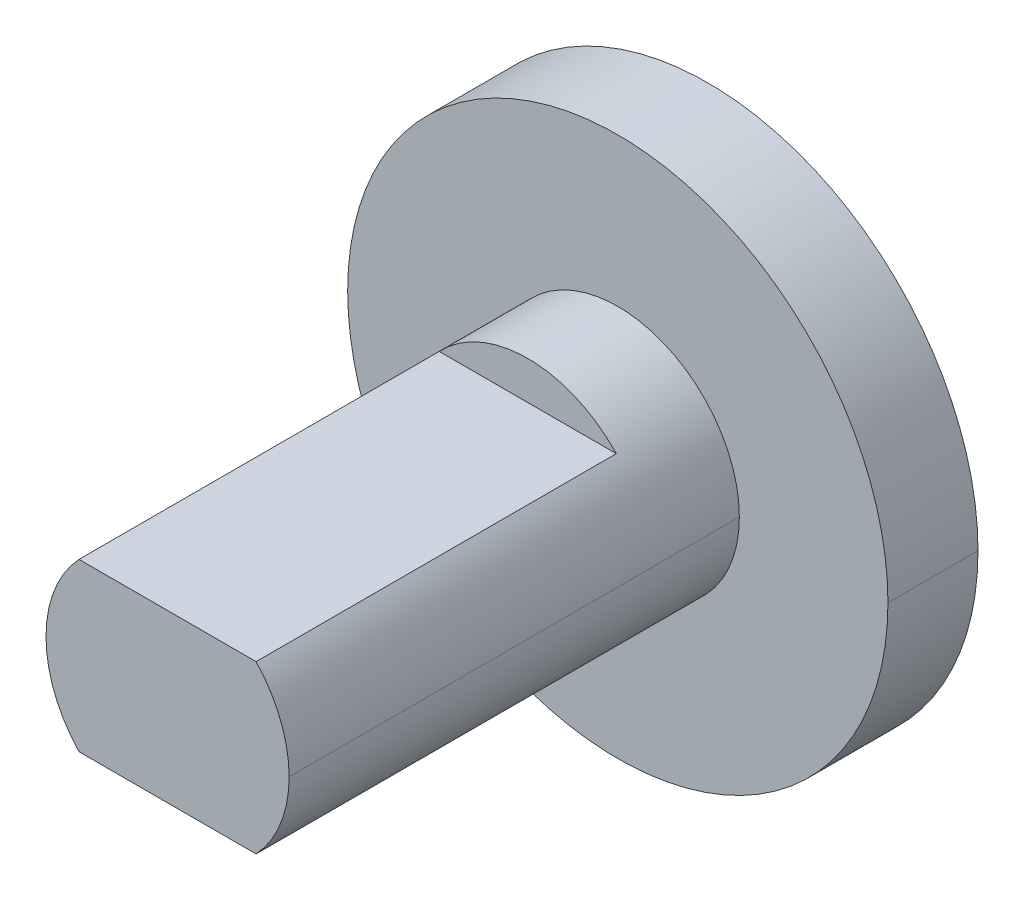
ISO-10303-21;
HEADER;
FILE_DESCRIPTION(('STEP AP214'),'2;1');
FILE_NAME('part.step','',(''),(''),'','','');
FILE_SCHEMA(('AUTOMOTIVE_DESIGN { 1 0 10303 214 1 1 1 1 }'));
ENDSEC;
DATA;
#1=APPLICATION_CONTEXT('core data for automotive mechanical design processes');
#2=APPLICATION_PROTOCOL_DEFINITION('international standard','automotive_design',2000,#1);
#3=PRODUCT_CONTEXT('',#1,'mechanical');
#4=PRODUCT('Part','Part','',(#3));
#5=PRODUCT_RELATED_PRODUCT_CATEGORY('part','',(#4));
#6=PRODUCT_DEFINITION_FORMATION('','',#4);
#7=PRODUCT_DEFINITION_CONTEXT('part definition',#1,'design');
#8=PRODUCT_DEFINITION('design','',#6,#7);
#9=PRODUCT_DEFINITION_SHAPE('','',#8);
#10=(LENGTH_UNIT() NAMED_UNIT(*) SI_UNIT(.MILLI.,.METRE.));
#11=(NAMED_UNIT(*) PLANE_ANGLE_UNIT() SI_UNIT($,.RADIAN.));
#12=(NAMED_UNIT(*) SI_UNIT($,.STERADIAN.) SOLID_ANGLE_UNIT());
#13=UNCERTAINTY_MEASURE_WITH_UNIT(LENGTH_MEASURE(1.E-05),#10,'distance_accuracy_value','');
#14=(GEOMETRIC_REPRESENTATION_CONTEXT(3) GLOBAL_UNCERTAINTY_ASSIGNED_CONTEXT((#13)) GLOBAL_UNIT_ASSIGNED_CONTEXT((#10,
#11,#12)) REPRESENTATION_CONTEXT('',''));
#15=CARTESIAN_POINT('',(0.,0.,0.));
#16=DIRECTION('',(0.,0.,1.));
#17=DIRECTION('',(1.,0.,0.));
#18=AXIS2_PLACEMENT_3D('',#15,#16,#17);
#19=CARTESIAN_POINT('',(0.,0.,-8.));
#20=DIRECTION('',(0.,0.,1.));
#21=DIRECTION('',(1.,0.,0.));
#22=AXIS2_PLACEMENT_3D('',#19,#20,#21);
#23=PLANE('',#22);
#24=CARTESIAN_POINT('',(0.,0.,-8.));
#25=DIRECTION('',(0.,0.,1.));
#26=DIRECTION('',(1.,0.,0.));
#27=AXIS2_PLACEMENT_3D('',#24,#25,#26);
#28=CIRCLE('',#27,2.7);
#29=CARTESIAN_POINT('',(1.96659604392971,1.85,-8.));
#30=VERTEX_POINT('',#29);
#31=CARTESIAN_POINT('',(-1.96659604392971,1.85,-8.));
#32=VERTEX_POINT('',#31);
#33=EDGE_CURVE('E221',#30,#32,#28,.T.);
#34=ORIENTED_EDGE('',*,*,#33,.T.);
#35=DIRECTION('',(1.,0.,0.));
#36=VECTOR('',#35,1.);
#37=CARTESIAN_POINT('',(-4.12392354490088,1.85,-8.));
#38=LINE('',#37,#36);
#39=EDGE_CURVE('E11',#32,#30,#38,.T.);
#40=ORIENTED_EDGE('',*,*,#39,.T.);
#41=EDGE_LOOP('',(#34,#40));
#42=FACE_BOUND('',#41,.T.);
#43=ADVANCED_FACE('F17',(#42),#23,.T.);
#44=CARTESIAN_POINT('',(-4.12392354490088,1.85,-8.));
#45=DIRECTION('',(0.,-1.,0.));
#46=DIRECTION('',(0.,0.,-1.));
#47=AXIS2_PLACEMENT_3D('',#44,#45,#46);
#48=PLANE('',#47);
#49=ORIENTED_EDGE('',*,*,#39,.F.);
#50=DIRECTION('',(0.,0.,-1.));
#51=VECTOR('',#50,1.);
#52=CARTESIAN_POINT('',(-1.96659604392971,1.85,28.327048658217));
#53=LINE('',#52,#51);
#54=CARTESIAN_POINT('',(-1.96659604392971,1.85,0.));
#55=VERTEX_POINT('',#54);
#56=EDGE_CURVE('E230',#55,#32,#53,.T.);
#57=ORIENTED_EDGE('',*,*,#56,.F.);
#58=DIRECTION('',(1.,0.,0.));
#59=VECTOR('',#58,1.);
#60=CARTESIAN_POINT('',(-4.12392354490088,1.85,0.));
#61=LINE('',#60,#59);
#62=CARTESIAN_POINT('',(1.96659604392971,1.85,0.));
#63=VERTEX_POINT('',#62);
#64=EDGE_CURVE('E127',#55,#63,#61,.T.);
#65=ORIENTED_EDGE('',*,*,#64,.T.);
#66=DIRECTION('',(0.,0.,1.));
#67=VECTOR('',#66,1.);
#68=CARTESIAN_POINT('',(1.96659604392971,1.85,28.327048658217));
#69=LINE('',#68,#67);
#70=EDGE_CURVE('E211',#30,#63,#69,.T.);
#71=ORIENTED_EDGE('',*,*,#70,.F.);
#72=EDGE_LOOP('',(#49,#57,#65,#71));
#73=FACE_BOUND('',#72,.T.);
#74=ADVANCED_FACE('F416',(#73),#48,.F.);
#75=CARTESIAN_POINT('',(0.,0.,-8.));
#76=DIRECTION('',(0.,0.,-1.));
#77=DIRECTION('',(0.,-1.,0.));
#78=AXIS2_PLACEMENT_3D('',#75,#76,#77);
#79=PLANE('',#78);
#80=DIRECTION('',(-1.,0.,0.));
#81=VECTOR('',#80,1.);
#82=CARTESIAN_POINT('',(-4.12392354490088,-1.85,-8.));
#83=LINE('',#82,#81);
#84=CARTESIAN_POINT('',(1.96659604392971,-1.85,-8.));
#85=VERTEX_POINT('',#84);
#86=CARTESIAN_POINT('',(-1.96659604392971,-1.85,-8.));
#87=VERTEX_POINT('',#86);
#88=EDGE_CURVE('E26',#85,#87,#83,.T.);
#89=ORIENTED_EDGE('',*,*,#88,.T.);
#90=CARTESIAN_POINT('',(0.,0.,-8.));
#91=DIRECTION('',(0.,0.,-1.));
#92=DIRECTION('',(-1.,0.,0.));
#93=AXIS2_PLACEMENT_3D('',#90,#91,#92);
#94=CIRCLE('',#93,2.7);
#95=EDGE_CURVE('E111',#85,#87,#94,.T.);
#96=ORIENTED_EDGE('',*,*,#95,.F.);
#97=EDGE_LOOP('',(#89,#96));
#98=FACE_BOUND('',#97,.T.);
#99=ADVANCED_FACE('F408',(#98),#79,.F.);
#100=CARTESIAN_POINT('',(-4.12392354490088,-1.85,-8.));
#101=DIRECTION('',(0.,1.,0.));
#102=DIRECTION('',(1.,0.,0.));
#103=AXIS2_PLACEMENT_3D('',#100,#101,#102);
#104=PLANE('',#103);
#105=ORIENTED_EDGE('',*,*,#88,.F.);
#106=DIRECTION('',(0.,0.,-1.));
#107=VECTOR('',#106,1.);
#108=CARTESIAN_POINT('',(1.96659604392971,-1.85,28.327048658217));
#109=LINE('',#108,#107);
#110=CARTESIAN_POINT('',(1.96659604392971,-1.85,0.));
#111=VERTEX_POINT('',#110);
#112=EDGE_CURVE('E97',#111,#85,#109,.T.);
#113=ORIENTED_EDGE('',*,*,#112,.F.);
#114=DIRECTION('',(-1.,0.,0.));
#115=VECTOR('',#114,1.);
#116=CARTESIAN_POINT('',(-4.12392354490088,-1.85,0.));
#117=LINE('',#116,#115);
#118=CARTESIAN_POINT('',(-1.96659604392971,-1.85,0.));
#119=VERTEX_POINT('',#118);
#120=EDGE_CURVE('E115',#111,#119,#117,.T.);
#121=ORIENTED_EDGE('',*,*,#120,.T.);
#122=DIRECTION('',(0.,0.,1.));
#123=VECTOR('',#122,1.);
#124=CARTESIAN_POINT('',(-1.96659604392971,-1.85,28.327048658217));
#125=LINE('',#124,#123);
#126=EDGE_CURVE('E105',#87,#119,#125,.T.);
#127=ORIENTED_EDGE('',*,*,#126,.F.);
#128=EDGE_LOOP('',(#105,#113,#121,#127));
#129=FACE_BOUND('',#128,.T.);
#130=ADVANCED_FACE('F116',(#129),#104,.F.);
#131=CARTESIAN_POINT('',(0.,6.,-12.));
#132=DIRECTION('',(0.,0.,1.));
#133=DIRECTION('',(1.,0.,0.));
#134=AXIS2_PLACEMENT_3D('',#131,#132,#133);
#135=PLANE('',#134);
#136=CARTESIAN_POINT('',(0.,0.,-12.));
#137=DIRECTION('',(0.,0.,1.));
#138=DIRECTION('',(1.,0.,0.));
#139=AXIS2_PLACEMENT_3D('',#136,#137,#138);
#140=CIRCLE('',#139,6.);
#141=CARTESIAN_POINT('',(6.,0.,-12.));
#142=VERTEX_POINT('',#141);
#143=CARTESIAN_POINT('',(-6.,0.,-12.));
#144=VERTEX_POINT('',#143);
#145=EDGE_CURVE('E288',#142,#144,#140,.T.);
#146=ORIENTED_EDGE('',*,*,#145,.F.);
#147=CARTESIAN_POINT('',(0.,0.,-12.));
#148=DIRECTION('',(0.,0.,1.));
#149=DIRECTION('',(1.,0.,0.));
#150=AXIS2_PLACEMENT_3D('',#147,#148,#149);
#151=CIRCLE('',#150,6.);
#152=EDGE_CURVE('E144',#144,#142,#151,.T.);
#153=ORIENTED_EDGE('',*,*,#152,.F.);
#154=EDGE_LOOP('',(#146,#153));
#155=FACE_BOUND('',#154,.T.);
#156=ADVANCED_FACE('F364',(#155),#135,.F.);
#157=CARTESIAN_POINT('',(0.,0.,28.327048658217));
#158=DIRECTION('',(0.,0.,1.));
#159=DIRECTION('',(1.,0.,0.));
#160=AXIS2_PLACEMENT_3D('',#157,#158,#159);
#161=CYLINDRICAL_SURFACE('',#160,6.);
#162=DIRECTION('',(0.,0.,1.));
#163=VECTOR('',#162,1.);
#164=CARTESIAN_POINT('',(-6.,0.,28.327048658217));
#165=LINE('',#164,#163);
#166=CARTESIAN_POINT('',(-6.,0.,-10.));
#167=VERTEX_POINT('',#166);
#168=EDGE_CURVE('E280',#144,#167,#165,.T.);
#169=ORIENTED_EDGE('',*,*,#168,.F.);
#170=ORIENTED_EDGE('',*,*,#152,.T.);
#171=DIRECTION('',(0.,0.,1.));
#172=VECTOR('',#171,1.);
#173=CARTESIAN_POINT('',(6.,0.,28.327048658217));
#174=LINE('',#173,#172);
#175=CARTESIAN_POINT('',(6.,0.,-10.));
#176=VERTEX_POINT('',#175);
#177=EDGE_CURVE('E263',#142,#176,#174,.T.);
#178=ORIENTED_EDGE('',*,*,#177,.T.);
#179=CARTESIAN_POINT('',(0.,0.,-10.));
#180=DIRECTION('',(0.,0.,1.));
#181=DIRECTION('',(1.,0.,0.));
#182=AXIS2_PLACEMENT_3D('',#179,#180,#181);
#183=CIRCLE('',#182,6.);
#184=EDGE_CURVE('E113',#167,#176,#183,.T.);
#185=ORIENTED_EDGE('',*,*,#184,.F.);
#186=EDGE_LOOP('',(#169,#170,#178,#185));
#187=FACE_BOUND('',#186,.T.);
#188=ADVANCED_FACE('F368',(#187),#161,.T.);
#189=CARTESIAN_POINT('',(0.,2.7,-10.));
#190=DIRECTION('',(0.,0.,-1.));
#191=DIRECTION('',(0.,-1.,0.));
#192=AXIS2_PLACEMENT_3D('',#189,#190,#191);
#193=PLANE('',#192);
#194=CARTESIAN_POINT('',(0.,0.,-10.));
#195=DIRECTION('',(0.,0.,1.));
#196=DIRECTION('',(1.,0.,0.));
#197=AXIS2_PLACEMENT_3D('',#194,#195,#196);
#198=CIRCLE('',#197,2.7);
#199=CARTESIAN_POINT('',(2.7,0.,-10.));
#200=VERTEX_POINT('',#199);
#201=CARTESIAN_POINT('',(-2.7,0.,-10.));
#202=VERTEX_POINT('',#201);
#203=EDGE_CURVE('E254',#200,#202,#198,.T.);
#204=ORIENTED_EDGE('',*,*,#203,.F.);
#205=CARTESIAN_POINT('',(0.,0.,-10.));
#206=DIRECTION('',(0.,0.,1.));
#207=DIRECTION('',(1.,0.,0.));
#208=AXIS2_PLACEMENT_3D('',#205,#206,#207);
#209=CIRCLE('',#208,2.7);
#210=EDGE_CURVE('E120',#202,#200,#209,.T.);
#211=ORIENTED_EDGE('',*,*,#210,.F.);
#212=EDGE_LOOP('',(#204,#211));
#213=FACE_BOUND('',#212,.T.);
#214=CARTESIAN_POINT('',(0.,0.,-10.));
#215=DIRECTION('',(0.,0.,1.));
#216=DIRECTION('',(1.,0.,0.));
#217=AXIS2_PLACEMENT_3D('',#214,#215,#216);
#218=CIRCLE('',#217,6.);
#219=EDGE_CURVE('E272',#176,#167,#218,.T.);
#220=ORIENTED_EDGE('',*,*,#219,.T.);
#221=ORIENTED_EDGE('',*,*,#184,.T.);
#222=EDGE_LOOP('',(#220,#221));
#223=FACE_BOUND('',#222,.T.);
#224=ADVANCED_FACE('F384',(#213,#223),#193,.F.);
#225=CARTESIAN_POINT('',(0.,0.,28.327048658217));
#226=DIRECTION('',(0.,0.,1.));
#227=DIRECTION('',(1.,0.,0.));
#228=AXIS2_PLACEMENT_3D('',#225,#226,#227);
#229=CYLINDRICAL_SURFACE('',#228,2.7);
#230=DIRECTION('',(0.,0.,1.));
#231=VECTOR('',#230,1.);
#232=CARTESIAN_POINT('',(-2.7,0.,28.327048658217));
#233=LINE('',#232,#231);
#234=CARTESIAN_POINT('',(-2.7,0.,0.));
#235=VERTEX_POINT('',#234);
#236=EDGE_CURVE('E245',#202,#235,#233,.T.);
#237=ORIENTED_EDGE('',*,*,#236,.F.);
#238=ORIENTED_EDGE('',*,*,#210,.T.);
#239=DIRECTION('',(0.,0.,1.));
#240=VECTOR('',#239,1.);
#241=CARTESIAN_POINT('',(2.7,0.,28.327048658217));
#242=LINE('',#241,#240);
#243=CARTESIAN_POINT('',(2.7,0.,0.));
#244=VERTEX_POINT('',#243);
#245=EDGE_CURVE('E192',#200,#244,#242,.T.);
#246=ORIENTED_EDGE('',*,*,#245,.T.);
#247=CARTESIAN_POINT('',(0.,0.,0.));
#248=DIRECTION('',(0.,0.,1.));
#249=DIRECTION('',(1.,0.,0.));
#250=AXIS2_PLACEMENT_3D('',#247,#248,#249);
#251=CIRCLE('',#250,2.7);
#252=EDGE_CURVE('E132',#111,#244,#251,.T.);
#253=ORIENTED_EDGE('',*,*,#252,.F.);
#254=ORIENTED_EDGE('',*,*,#112,.T.);
#255=ORIENTED_EDGE('',*,*,#95,.T.);
#256=ORIENTED_EDGE('',*,*,#126,.T.);
#257=CARTESIAN_POINT('',(0.,0.,0.));
#258=DIRECTION('',(0.,0.,1.));
#259=DIRECTION('',(1.,0.,0.));
#260=AXIS2_PLACEMENT_3D('',#257,#258,#259);
#261=CIRCLE('',#260,2.7);
#262=EDGE_CURVE('E109',#235,#119,#261,.T.);
#263=ORIENTED_EDGE('',*,*,#262,.F.);
#264=EDGE_LOOP('',(#237,#238,#246,#253,#254,#255,#256,#263));
#265=FACE_BOUND('',#264,.T.);
#266=ADVANCED_FACE('F107',(#265),#229,.T.);
#267=CARTESIAN_POINT('',(0.,0.,0.));
#268=DIRECTION('',(0.,0.,-1.));
#269=DIRECTION('',(0.,-1.,0.));
#270=AXIS2_PLACEMENT_3D('',#267,#268,#269);
#271=PLANE('',#270);
#272=ORIENTED_EDGE('',*,*,#252,.T.);
#273=CARTESIAN_POINT('',(0.,0.,0.));
#274=DIRECTION('',(0.,0.,1.));
#275=DIRECTION('',(1.,0.,0.));
#276=AXIS2_PLACEMENT_3D('',#273,#274,#275);
#277=CIRCLE('',#276,2.7);
#278=EDGE_CURVE('E201',#244,#63,#277,.T.);
#279=ORIENTED_EDGE('',*,*,#278,.T.);
#280=ORIENTED_EDGE('',*,*,#64,.F.);
#281=CARTESIAN_POINT('',(0.,0.,0.));
#282=DIRECTION('',(0.,0.,1.));
#283=DIRECTION('',(1.,0.,0.));
#284=AXIS2_PLACEMENT_3D('',#281,#282,#283);
#285=CIRCLE('',#284,2.7);
#286=EDGE_CURVE('E124',#55,#235,#285,.T.);
#287=ORIENTED_EDGE('',*,*,#286,.T.);
#288=ORIENTED_EDGE('',*,*,#262,.T.);
#289=ORIENTED_EDGE('',*,*,#120,.F.);
#290=EDGE_LOOP('',(#272,#279,#280,#287,#288,#289));
#291=FACE_BOUND('',#290,.T.);
#292=ADVANCED_FACE('F122',(#291),#271,.F.);
#293=CARTESIAN_POINT('',(0.,0.,28.327048658217));
#294=DIRECTION('',(0.,0.,1.));
#295=DIRECTION('',(1.,0.,0.));
#296=AXIS2_PLACEMENT_3D('',#293,#294,#295);
#297=CYLINDRICAL_SURFACE('',#296,2.7);
#298=ORIENTED_EDGE('',*,*,#203,.T.);
#299=ORIENTED_EDGE('',*,*,#236,.T.);
#300=ORIENTED_EDGE('',*,*,#286,.F.);
#301=ORIENTED_EDGE('',*,*,#56,.T.);
#302=ORIENTED_EDGE('',*,*,#33,.F.);
#303=ORIENTED_EDGE('',*,*,#70,.T.);
#304=ORIENTED_EDGE('',*,*,#278,.F.);
#305=ORIENTED_EDGE('',*,*,#245,.F.);
#306=EDGE_LOOP('',(#298,#299,#300,#301,#302,#303,#304,#305));
#307=FACE_BOUND('',#306,.T.);
#308=ADVANCED_FACE('F350',(#307),#297,.T.);
#309=CARTESIAN_POINT('',(0.,0.,28.327048658217));
#310=DIRECTION('',(0.,0.,1.));
#311=DIRECTION('',(1.,0.,0.));
#312=AXIS2_PLACEMENT_3D('',#309,#310,#311);
#313=CYLINDRICAL_SURFACE('',#312,6.);
#314=ORIENTED_EDGE('',*,*,#145,.T.);
#315=ORIENTED_EDGE('',*,*,#168,.T.);
#316=ORIENTED_EDGE('',*,*,#219,.F.);
#317=ORIENTED_EDGE('',*,*,#177,.F.);
#318=EDGE_LOOP('',(#314,#315,#316,#317));
#319=FACE_BOUND('',#318,.T.);
#320=ADVANCED_FACE('F346',(#319),#313,.T.);
#321=CLOSED_SHELL('',(#43,#74,#99,#130,#156,#188,#224,#266,#292,#308,#320));
#322=MANIFOLD_SOLID_BREP('B1',#321);
#323=ADVANCED_BREP_SHAPE_REPRESENTATION('',(#18,#322),#14);
#324=SHAPE_DEFINITION_REPRESENTATION(#9,#323);
ENDSEC;
END-ISO-10303-21;
